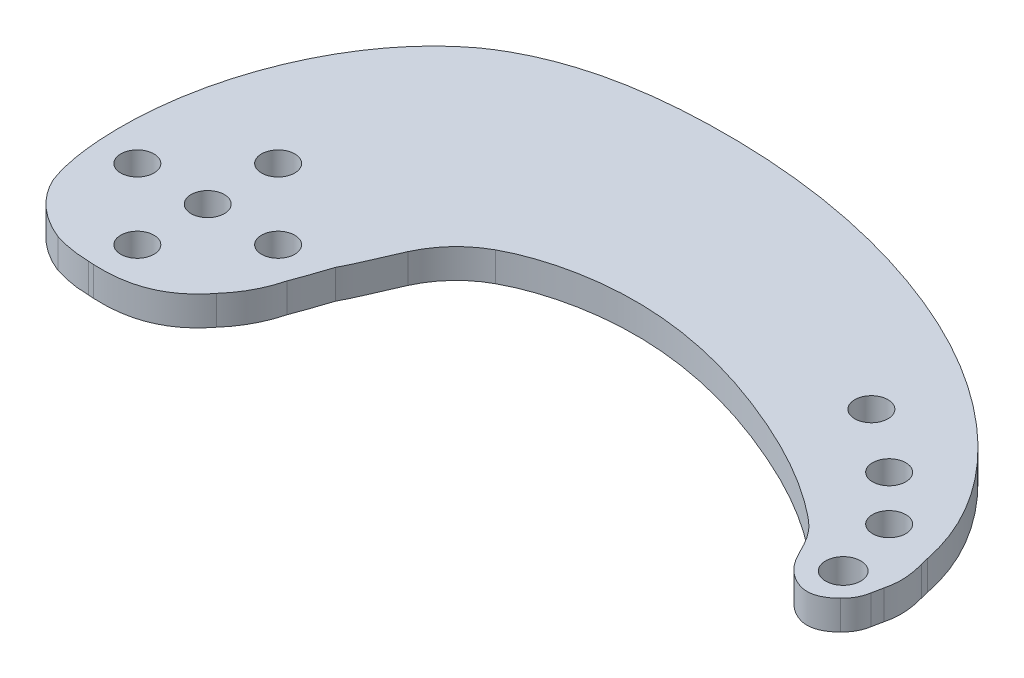
ISO-10303-21;
HEADER;
FILE_DESCRIPTION(('STEP AP214'),'2;1');
FILE_NAME('part.step','',(''),(''),'','','');
FILE_SCHEMA(('AUTOMOTIVE_DESIGN { 1 0 10303 214 1 1 1 1 }'));
ENDSEC;
DATA;
#1=APPLICATION_CONTEXT('core data for automotive mechanical design processes');
#2=APPLICATION_PROTOCOL_DEFINITION('international standard','automotive_design',2000,#1);
#3=PRODUCT_CONTEXT('',#1,'mechanical');
#4=PRODUCT('Part','Part','',(#3));
#5=PRODUCT_RELATED_PRODUCT_CATEGORY('part','',(#4));
#6=PRODUCT_DEFINITION_FORMATION('','',#4);
#7=PRODUCT_DEFINITION_CONTEXT('part definition',#1,'design');
#8=PRODUCT_DEFINITION('design','',#6,#7);
#9=PRODUCT_DEFINITION_SHAPE('','',#8);
#10=(LENGTH_UNIT() NAMED_UNIT(*) SI_UNIT(.MILLI.,.METRE.));
#11=(NAMED_UNIT(*) PLANE_ANGLE_UNIT() SI_UNIT($,.RADIAN.));
#12=(NAMED_UNIT(*) SI_UNIT($,.STERADIAN.) SOLID_ANGLE_UNIT());
#13=UNCERTAINTY_MEASURE_WITH_UNIT(LENGTH_MEASURE(1.E-05),#10,'distance_accuracy_value','');
#14=(GEOMETRIC_REPRESENTATION_CONTEXT(3) GLOBAL_UNCERTAINTY_ASSIGNED_CONTEXT((#13)) GLOBAL_UNIT_ASSIGNED_CONTEXT((#10,
#11,#12)) REPRESENTATION_CONTEXT('',''));
#15=CARTESIAN_POINT('',(0.,0.,0.));
#16=DIRECTION('',(0.,0.,1.));
#17=DIRECTION('',(1.,0.,0.));
#18=AXIS2_PLACEMENT_3D('',#15,#16,#17);
#19=CARTESIAN_POINT('',(0.,3.,0.));
#20=DIRECTION('',(0.,-1.,0.));
#21=DIRECTION('',(0.,0.,-1.));
#22=AXIS2_PLACEMENT_3D('',#19,#20,#21);
#23=CYLINDRICAL_SURFACE('',#22,11.2);
#24=CARTESIAN_POINT('',(0.,0.,0.));
#25=DIRECTION('',(0.,1.,0.));
#26=DIRECTION('',(-0.0956098133632832,0.,0.995418888503045));
#27=AXIS2_PLACEMENT_3D('',#24,#25,#26);
#28=CIRCLE('',#27,11.2);
#29=CARTESIAN_POINT('',(-1.07082990966877,0.,11.1486915512341));
#30=VERTEX_POINT('',#29);
#31=CARTESIAN_POINT('',(-0.500551392967735,0.,11.1888090654456));
#32=VERTEX_POINT('',#31);
#33=EDGE_CURVE('E462',#30,#32,#28,.T.);
#34=ORIENTED_EDGE('',*,*,#33,.T.);
#35=DIRECTION('',(0.,1.,0.));
#36=VECTOR('',#35,1.);
#37=CARTESIAN_POINT('',(-0.500551392967735,0.,11.1888090654456));
#38=LINE('',#37,#36);
#39=CARTESIAN_POINT('',(-0.500551392967735,3.,11.1888090654456));
#40=VERTEX_POINT('',#39);
#41=EDGE_CURVE('E569',#32,#40,#38,.T.);
#42=ORIENTED_EDGE('',*,*,#41,.T.);
#43=CARTESIAN_POINT('',(-1.07082990966877,3.,11.1486915512341));
#44=CARTESIAN_POINT('',(-0.7820844804733,3.,11.1737472207998));
#45=CARTESIAN_POINT('',(-0.500551392967734,3.,11.1888090654456));
#46=B_SPLINE_CURVE_WITH_KNOTS('',2,(#43,#44,#45),.UNSPECIFIED.,.F.,.F.,(3,3),(0.,1.),.UNSPECIFIED.);
#47=CARTESIAN_POINT('',(-1.07082990966877,3.,11.1486915512341));
#48=VERTEX_POINT('',#47);
#49=EDGE_CURVE('E388',#48,#40,#46,.T.);
#50=ORIENTED_EDGE('',*,*,#49,.F.);
#51=DIRECTION('',(0.,-1.,0.));
#52=VECTOR('',#51,1.);
#53=CARTESIAN_POINT('',(-1.07082990966876,3.,11.1486915512341));
#54=LINE('',#53,#52);
#55=EDGE_CURVE('E485',#30,#48,#54,.F.);
#56=ORIENTED_EDGE('',*,*,#55,.F.);
#57=EDGE_LOOP('',(#34,#42,#50,#56));
#58=FACE_BOUND('',#57,.T.);
#59=ADVANCED_FACE('F91',(#58),#23,.T.);
#60=CARTESIAN_POINT('',(0.,3.,0.));
#61=DIRECTION('',(0.,1.,0.));
#62=DIRECTION('',(0.,0.,1.));
#63=AXIS2_PLACEMENT_3D('',#60,#61,#62);
#64=PLANE('',#63);
#65=CARTESIAN_POINT('',(63.2,3.,-6.5));
#66=DIRECTION('',(0.,1.,0.));
#67=DIRECTION('',(0.,0.,1.));
#68=AXIS2_PLACEMENT_3D('',#65,#66,#67);
#69=CIRCLE('',#68,1.7);
#70=CARTESIAN_POINT('',(63.2,3.,-4.8));
#71=VERTEX_POINT('',#70);
#72=EDGE_CURVE('E987',#71,#71,#69,.F.);
#73=ORIENTED_EDGE('',*,*,#72,.T.);
#74=EDGE_LOOP('',(#73));
#75=FACE_BOUND('',#74,.T.);
#76=CARTESIAN_POINT('',(58.6038059222874,3.,-11.0961940777125));
#77=DIRECTION('',(0.,1.,0.));
#78=DIRECTION('',(0.,0.,1.));
#79=AXIS2_PLACEMENT_3D('',#76,#77,#78);
#80=CIRCLE('',#79,1.7);
#81=CARTESIAN_POINT('',(58.6038059222874,3.,-9.39619407771254));
#82=VERTEX_POINT('',#81);
#83=EDGE_CURVE('E992',#82,#82,#80,.F.);
#84=ORIENTED_EDGE('',*,*,#83,.T.);
#85=EDGE_LOOP('',(#84));
#86=FACE_BOUND('',#85,.T.);
#87=CARTESIAN_POINT('',(52.1101936762081,3.,-15.7687736647895));
#88=DIRECTION('',(0.,1.,0.));
#89=DIRECTION('',(0.,0.,1.));
#90=AXIS2_PLACEMENT_3D('',#87,#88,#89);
#91=CIRCLE('',#90,1.7);
#92=CARTESIAN_POINT('',(52.1101936762081,3.,-14.0687736647895));
#93=VERTEX_POINT('',#92);
#94=EDGE_CURVE('E996',#93,#93,#91,.F.);
#95=ORIENTED_EDGE('',*,*,#94,.T.);
#96=EDGE_LOOP('',(#95));
#97=FACE_BOUND('',#96,.T.);
#98=CARTESIAN_POINT('',(65.,3.,0.));
#99=DIRECTION('',(0.,1.,0.));
#100=DIRECTION('',(0.,0.,1.));
#101=AXIS2_PLACEMENT_3D('',#98,#99,#100);
#102=CIRCLE('',#101,1.80000000000001);
#103=CARTESIAN_POINT('',(65.,3.,1.80000000000001));
#104=VERTEX_POINT('',#103);
#105=EDGE_CURVE('E933',#104,#104,#102,.T.);
#106=ORIENTED_EDGE('',*,*,#105,.F.);
#107=EDGE_LOOP('',(#106));
#108=FACE_BOUND('',#107,.T.);
#109=CARTESIAN_POINT('',(68.3632749160278,3.,0.498379212265056));
#110=CARTESIAN_POINT('',(69.5327089634744,3.,-7.7302803130244));
#111=CARTESIAN_POINT('',(60.7384695037157,3.,-20.6272429609478));
#112=CARTESIAN_POINT('',(41.0241697035814,3.,-30.6364465018669));
#113=CARTESIAN_POINT('',(20.6209181442055,3.,-33.8057098678775));
#114=CARTESIAN_POINT('',(-5.25987588241526,3.,-29.9907346934263));
#115=CARTESIAN_POINT('',(-13.0726520334382,3.,-6.85879772464961));
#116=CARTESIAN_POINT('',(-10.2681549656934,3.,6.40085845963503));
#117=CARTESIAN_POINT('',(-7.77552409360497,3.,9.61750499049109));
#118=CARTESIAN_POINT('',(-6.46678399127295,3.,9.92262308179974));
#119=CARTESIAN_POINT('',(-2.2618839795888,3.,11.5691317782158));
#120=CARTESIAN_POINT('',(2.33580518995126,3.,11.7732460886042));
#121=CARTESIAN_POINT('',(5.20536417423154,3.,8.2634579312481));
#122=B_SPLINE_CURVE_WITH_KNOTS('',3,(#109,#110,#111,#112,#113,#114,#115,#116,#117,#118,#119,
#120,#121),.UNSPECIFIED.,.F.,.F.,(4,1,1,1,1,1,1,1,1,1,4),(0.,0.167183894636653,
0.308915577855566,0.466622558771847,0.613185697930883,0.827690468210519,0.890097790332227,
0.902058544269931,0.911312026569738,0.918105774154869,1.),.UNSPECIFIED.);
#123=CARTESIAN_POINT('',(-4.79988543367924,3.,10.5280435978897));
#124=VERTEX_POINT('',#123);
#125=EDGE_CURVE('E393',#124,#48,#122,.T.);
#126=ORIENTED_EDGE('',*,*,#125,.T.);
#127=ORIENTED_EDGE('',*,*,#49,.T.);
#128=CARTESIAN_POINT('',(-1.07082990966877,3.,11.1486915512341));
#129=CARTESIAN_POINT('',(7.81266966781571,3.,11.9195506107889));
#130=CARTESIAN_POINT('',(10.9618115500225,3.,2.85605975736582));
#131=CARTESIAN_POINT('',(14.7812707981767,3.,-9.24234019275426));
#132=CARTESIAN_POINT('',(28.5331248385567,3.,-15.1819594990336));
#133=CARTESIAN_POINT('',(44.1775618963078,3.,-11.5506373885507));
#134=CARTESIAN_POINT('',(55.3322907540599,3.,-5.54631353971218));
#135=CARTESIAN_POINT('',(59.4573127879503,3.,-2.13431577156615));
#136=CARTESIAN_POINT('',(60.7283813003198,3.,-0.393004227935778));
#137=CARTESIAN_POINT('',(61.5844545824662,3.,1.82814258342087));
#138=CARTESIAN_POINT('',(63.3373024328888,3.,3.34424394509867));
#139=CARTESIAN_POINT('',(65.4368624793034,3.,3.89829590449388));
#140=CARTESIAN_POINT('',(66.710060657466,3.,3.14542913254168));
#141=CARTESIAN_POINT('',(67.2675928087478,3.,2.5333817031224));
#142=B_SPLINE_CURVE_WITH_KNOTS('',3,(#128,#129,#130,#131,#132,#133,#134,#135,#136,#137,#138,
#139,#140,#141),.UNSPECIFIED.,.F.,.F.,(4,1,1,1,1,1,1,1,1,1,1,4),(0.,0.226108573531062,
0.317463520043916,0.429095875415199,0.705433637537204,0.851538595778845,0.872297983996491,
0.892425070632198,0.926476327540622,0.95470608552602,0.970022879338464,1.),.UNSPECIFIED.);
#143=CARTESIAN_POINT('',(8.34500863911296,3.,7.46999536901664));
#144=VERTEX_POINT('',#143);
#145=EDGE_CURVE('E229',#40,#144,#142,.T.);
#146=ORIENTED_EDGE('',*,*,#145,.T.);
#147=CARTESIAN_POINT('',(0.,3.,0.));
#148=DIRECTION('',(0.,1.,0.));
#149=DIRECTION('',(0.,0.,1.));
#150=AXIS2_PLACEMENT_3D('',#147,#148,#149);
#151=CIRCLE('',#150,11.2);
#152=CARTESIAN_POINT('',(10.8591488557205,3.,2.74205873921496));
#153=VERTEX_POINT('',#152);
#154=EDGE_CURVE('E284',#144,#153,#151,.T.);
#155=ORIENTED_EDGE('',*,*,#154,.T.);
#156=CARTESIAN_POINT('',(12.1345021406351,3.,-0.93400958023566));
#157=VERTEX_POINT('',#156);
#158=EDGE_CURVE('E932',#153,#157,#142,.T.);
#159=ORIENTED_EDGE('',*,*,#158,.T.);
#160=CARTESIAN_POINT('',(11.2,3.,0.));
#161=CARTESIAN_POINT('',(12.4456138486092,3.,0.0569469326884399));
#162=CARTESIAN_POINT('',(16.5714079345787,3.,-16.8023603290307));
#163=CARTESIAN_POINT('',(35.7888249050512,3.,-14.2526836415331));
#164=CARTESIAN_POINT('',(51.249640160631,3.,-9.44242237656511));
#165=CARTESIAN_POINT('',(60.2382591428152,3.,-2.74156307411873));
#166=CARTESIAN_POINT('',(64.7703602781485,3.,5.18735759287177));
#167=CARTESIAN_POINT('',(69.2065771426152,3.,0.00249513195444879));
#168=CARTESIAN_POINT('',(68.3960994393687,3.,-6.37671389292951));
#169=CARTESIAN_POINT('',(55.9681183284351,3.,-24.9502162671026));
#170=CARTESIAN_POINT('',(5.62590445738057,3.,-36.5085659273181));
#171=CARTESIAN_POINT('',(9.99049700339859,3.,-0.0552960179519843));
#172=CARTESIAN_POINT('',(11.2,3.,0.));
#173=B_SPLINE_CURVE_WITH_KNOTS('',3,(#160,#161,#162,#163,#164,#165,#166,#167,#168,#169,#170,
#171,#172),.UNSPECIFIED.,.T.,.F.,(4,1,1,1,1,1,1,1,1,1,4),(0.,0.0811612165853412,
0.198317789022384,0.331056991872656,0.406547512564206,0.438622354198174,0.470697195832143,
0.501390038427487,0.565670643333817,0.921191680088181,1.),.UNSPECIFIED.);
#174=CARTESIAN_POINT('',(14.442898006834,3.,-6.02607582134549));
#175=VERTEX_POINT('',#174);
#176=EDGE_CURVE('E256',#157,#175,#173,.T.);
#177=ORIENTED_EDGE('',*,*,#176,.T.);
#178=CARTESIAN_POINT('',(23.5409924137367,3.,-1.8758134003549));
#179=DIRECTION('',(0.,1.,0.));
#180=DIRECTION('',(0.,0.,1.));
#181=AXIS2_PLACEMENT_3D('',#178,#179,#180);
#182=CIRCLE('',#181,10.);
#183=CARTESIAN_POINT('',(18.77797037029,3.,-10.668629844114));
#184=VERTEX_POINT('',#183);
#185=EDGE_CURVE('E930',#175,#184,#182,.F.);
#186=ORIENTED_EDGE('',*,*,#185,.T.);
#187=CARTESIAN_POINT('',(67.2675928087478,3.,2.5333817031224));
#188=VERTEX_POINT('',#187);
#189=EDGE_CURVE('E929',#184,#188,#142,.T.);
#190=ORIENTED_EDGE('',*,*,#189,.T.);
#191=CARTESIAN_POINT('',(65.,3.,0.));
#192=DIRECTION('',(0.,1.,0.));
#193=DIRECTION('',(0.,0.,1.));
#194=AXIS2_PLACEMENT_3D('',#191,#192,#193);
#195=CIRCLE('',#194,3.4);
#196=CARTESIAN_POINT('',(68.3632749160278,3.,0.498379212265056));
#197=VERTEX_POINT('',#196);
#198=EDGE_CURVE('E236',#188,#197,#195,.T.);
#199=ORIENTED_EDGE('',*,*,#198,.T.);
#200=CARTESIAN_POINT('',(68.5837850238534,3.,-0.577958598186552));
#201=CARTESIAN_POINT('',(68.4439211205088,3.,-0.0458556794172109));
#202=CARTESIAN_POINT('',(68.3632749160279,3.,0.498379212265056));
#203=(BOUNDED_CURVE() B_SPLINE_CURVE(2,(#200,#201,#202),.UNSPECIFIED.,.F.,
.F.) B_SPLINE_CURVE_WITH_KNOTS((3,3),(0.,1.),
.UNSPECIFIED.) CURVE() GEOMETRIC_REPRESENTATION_ITEM() RATIONAL_B_SPLINE_CURVE((1.,
0.99848995013738,1.)) REPRESENTATION_ITEM(''));
#204=CARTESIAN_POINT('',(68.5837850238534,3.,-0.577958598186534));
#205=VERTEX_POINT('',#204);
#206=EDGE_CURVE('E438',#197,#205,#203,.F.);
#207=ORIENTED_EDGE('',*,*,#206,.T.);
#208=CARTESIAN_POINT('',(68.3925200024542,3.,-4.62779751741606));
#209=VERTEX_POINT('',#208);
#210=EDGE_CURVE('E294',#205,#209,#173,.T.);
#211=ORIENTED_EDGE('',*,*,#210,.T.);
#212=CARTESIAN_POINT('',(78.0178833995298,3.,-7.33932466539684));
#213=DIRECTION('',(0.,1.,0.));
#214=DIRECTION('',(0.,0.,1.));
#215=AXIS2_PLACEMENT_3D('',#212,#213,#214);
#216=CIRCLE('',#215,10.);
#217=CARTESIAN_POINT('',(68.2066528093629,3.,-5.40548022838214));
#218=VERTEX_POINT('',#217);
#219=EDGE_CURVE('E14',#209,#218,#216,.F.);
#220=ORIENTED_EDGE('',*,*,#219,.T.);
#221=CARTESIAN_POINT('',(0.0138210508619621,3.,-27.6880218674776));
#222=VERTEX_POINT('',#221);
#223=EDGE_CURVE('E492',#218,#222,#122,.T.);
#224=ORIENTED_EDGE('',*,*,#223,.T.);
#225=CARTESIAN_POINT('',(-1.07082990966877,3.,11.1486915512341));
#226=CARTESIAN_POINT('',(-4.63209882172822,3.,11.3725423228068));
#227=CARTESIAN_POINT('',(-9.74374591302616,3.,8.36577886155107));
#228=CARTESIAN_POINT('',(-10.9059828329124,3.,2.80619952022057));
#229=CARTESIAN_POINT('',(-12.5638425339583,3.,-11.2275648792662));
#230=CARTESIAN_POINT('',(-5.89160509364851,3.,-27.3023323297547));
#231=CARTESIAN_POINT('',(6.19807491272095,3.,-30.7694132466769));
#232=B_SPLINE_CURVE_WITH_KNOTS('',3,(#225,#226,#227,#228,#229,#230,#231),.UNSPECIFIED.,.F.,.F.,
(4,1,1,1,4),(0.,0.203093443995204,0.264365632395995,0.313017021780033,1.),.UNSPECIFIED.);
#233=CARTESIAN_POINT('',(-11.131062852218,3.,-5.72574957686047));
#234=VERTEX_POINT('',#233);
#235=EDGE_CURVE('E547',#234,#222,#232,.T.);
#236=ORIENTED_EDGE('',*,*,#235,.F.);
#237=CARTESIAN_POINT('',(-11.2000000245663,3.,-3.2727820953869E-07));
#238=VERTEX_POINT('',#237);
#239=EDGE_CURVE('E499',#234,#238,#122,.T.);
#240=ORIENTED_EDGE('',*,*,#239,.T.);
#241=CARTESIAN_POINT('',(-10.8970833817113,3.,2.58719418769911));
#242=VERTEX_POINT('',#241);
#243=EDGE_CURVE('E555',#242,#238,#232,.T.);
#244=ORIENTED_EDGE('',*,*,#243,.F.);
#245=CARTESIAN_POINT('',(-10.0484737126304,3.,5.75614022844135));
#246=VERTEX_POINT('',#245);
#247=EDGE_CURVE('E500',#242,#246,#122,.T.);
#248=ORIENTED_EDGE('',*,*,#247,.T.);
#249=EDGE_CURVE('E557',#124,#246,#232,.T.);
#250=ORIENTED_EDGE('',*,*,#249,.F.);
#251=EDGE_LOOP('',(#126,#127,#146,#155,#159,#177,#186,#190,#199,#207,#211,#220,#224,#236,#240,
#244,#248,#250));
#252=FACE_BOUND('',#251,.T.);
#253=CARTESIAN_POINT('',(0.,3.,7.2));
#254=DIRECTION('',(0.,1.,0.));
#255=DIRECTION('',(0.,0.,1.));
#256=AXIS2_PLACEMENT_3D('',#253,#254,#255);
#257=CIRCLE('',#256,1.7);
#258=CARTESIAN_POINT('',(0.,3.,8.9));
#259=VERTEX_POINT('',#258);
#260=EDGE_CURVE('E289',#259,#259,#257,.T.);
#261=ORIENTED_EDGE('',*,*,#260,.F.);
#262=EDGE_LOOP('',(#261));
#263=FACE_BOUND('',#262,.T.);
#264=CARTESIAN_POINT('',(7.2,3.,0.));
#265=DIRECTION('',(0.,1.,0.));
#266=DIRECTION('',(0.,0.,1.));
#267=AXIS2_PLACEMENT_3D('',#264,#265,#266);
#268=CIRCLE('',#267,1.7);
#269=CARTESIAN_POINT('',(7.2,3.,1.7));
#270=VERTEX_POINT('',#269);
#271=EDGE_CURVE('E894',#270,#270,#268,.T.);
#272=ORIENTED_EDGE('',*,*,#271,.F.);
#273=EDGE_LOOP('',(#272));
#274=FACE_BOUND('',#273,.T.);
#275=CARTESIAN_POINT('',(0.,3.,-7.2));
#276=DIRECTION('',(0.,1.,0.));
#277=DIRECTION('',(0.,0.,1.));
#278=AXIS2_PLACEMENT_3D('',#275,#276,#277);
#279=CIRCLE('',#278,1.7);
#280=CARTESIAN_POINT('',(0.,3.,-5.5));
#281=VERTEX_POINT('',#280);
#282=EDGE_CURVE('E908',#281,#281,#279,.T.);
#283=ORIENTED_EDGE('',*,*,#282,.F.);
#284=EDGE_LOOP('',(#283));
#285=FACE_BOUND('',#284,.T.);
#286=CARTESIAN_POINT('',(0.,3.,0.));
#287=DIRECTION('',(0.,1.,0.));
#288=DIRECTION('',(0.,0.,1.));
#289=AXIS2_PLACEMENT_3D('',#286,#287,#288);
#290=CIRCLE('',#289,1.7);
#291=CARTESIAN_POINT('',(0.,3.,1.7));
#292=VERTEX_POINT('',#291);
#293=EDGE_CURVE('E914',#292,#292,#290,.T.);
#294=ORIENTED_EDGE('',*,*,#293,.F.);
#295=EDGE_LOOP('',(#294));
#296=FACE_BOUND('',#295,.T.);
#297=CARTESIAN_POINT('',(-7.2,3.,0.));
#298=DIRECTION('',(0.,1.,0.));
#299=DIRECTION('',(0.,0.,1.));
#300=AXIS2_PLACEMENT_3D('',#297,#298,#299);
#301=CIRCLE('',#300,1.7);
#302=CARTESIAN_POINT('',(-7.2,3.,1.7));
#303=VERTEX_POINT('',#302);
#304=EDGE_CURVE('E920',#303,#303,#301,.T.);
#305=ORIENTED_EDGE('',*,*,#304,.F.);
#306=EDGE_LOOP('',(#305));
#307=FACE_BOUND('',#306,.T.);
#308=ADVANCED_FACE('F395',(#75,#86,#97,#108,#252,#263,#274,#285,#296,#307),#64,.T.);
#309=CARTESIAN_POINT('',(0.,0.,0.));
#310=DIRECTION('',(0.,1.,0.));
#311=DIRECTION('',(0.,0.,1.));
#312=AXIS2_PLACEMENT_3D('',#309,#310,#311);
#313=PLANE('',#312);
#314=CARTESIAN_POINT('',(63.2,0.,-6.5));
#315=DIRECTION('',(0.,1.,0.));
#316=DIRECTION('',(0.,0.,1.));
#317=AXIS2_PLACEMENT_3D('',#314,#315,#316);
#318=CIRCLE('',#317,1.7);
#319=CARTESIAN_POINT('',(63.2,0.,-4.8));
#320=VERTEX_POINT('',#319);
#321=EDGE_CURVE('E1000',#320,#320,#318,.T.);
#322=ORIENTED_EDGE('',*,*,#321,.T.);
#323=EDGE_LOOP('',(#322));
#324=FACE_BOUND('',#323,.T.);
#325=CARTESIAN_POINT('',(58.6038059222874,0.,-11.0961940777125));
#326=DIRECTION('',(0.,1.,0.));
#327=DIRECTION('',(0.,0.,1.));
#328=AXIS2_PLACEMENT_3D('',#325,#326,#327);
#329=CIRCLE('',#328,1.7);
#330=CARTESIAN_POINT('',(58.6038059222874,0.,-9.39619407771254));
#331=VERTEX_POINT('',#330);
#332=EDGE_CURVE('E1005',#331,#331,#329,.T.);
#333=ORIENTED_EDGE('',*,*,#332,.T.);
#334=EDGE_LOOP('',(#333));
#335=FACE_BOUND('',#334,.T.);
#336=CARTESIAN_POINT('',(52.1101936762081,0.,-15.7687736647895));
#337=DIRECTION('',(0.,1.,0.));
#338=DIRECTION('',(0.,0.,1.));
#339=AXIS2_PLACEMENT_3D('',#336,#337,#338);
#340=CIRCLE('',#339,1.7);
#341=CARTESIAN_POINT('',(52.1101936762081,0.,-14.0687736647895));
#342=VERTEX_POINT('',#341);
#343=EDGE_CURVE('E1001',#342,#342,#340,.T.);
#344=ORIENTED_EDGE('',*,*,#343,.T.);
#345=EDGE_LOOP('',(#344));
#346=FACE_BOUND('',#345,.T.);
#347=CARTESIAN_POINT('',(65.,0.,0.));
#348=DIRECTION('',(0.,1.,0.));
#349=DIRECTION('',(0.,0.,1.));
#350=AXIS2_PLACEMENT_3D('',#347,#348,#349);
#351=CIRCLE('',#350,1.80000000000001);
#352=CARTESIAN_POINT('',(65.,0.,1.80000000000001));
#353=VERTEX_POINT('',#352);
#354=EDGE_CURVE('E939',#353,#353,#351,.T.);
#355=ORIENTED_EDGE('',*,*,#354,.T.);
#356=EDGE_LOOP('',(#355));
#357=FACE_BOUND('',#356,.T.);
#358=ORIENTED_EDGE('',*,*,#33,.F.);
#359=CARTESIAN_POINT('',(68.3632749160278,0.,0.498379212265056));
#360=CARTESIAN_POINT('',(69.5327089634744,0.,-7.7302803130244));
#361=CARTESIAN_POINT('',(60.7384695037157,0.,-20.6272429609478));
#362=CARTESIAN_POINT('',(41.0241697035814,0.,-30.6364465018669));
#363=CARTESIAN_POINT('',(20.6209181442055,0.,-33.8057098678775));
#364=CARTESIAN_POINT('',(-5.25987588241526,0.,-29.9907346934263));
#365=CARTESIAN_POINT('',(-13.0726520334382,0.,-6.85879772464961));
#366=CARTESIAN_POINT('',(-10.2681549656934,0.,6.40085845963503));
#367=CARTESIAN_POINT('',(-7.77552409360497,0.,9.61750499049109));
#368=CARTESIAN_POINT('',(-6.46678399127295,0.,9.92262308179974));
#369=CARTESIAN_POINT('',(-2.2618839795888,0.,11.5691317782158));
#370=CARTESIAN_POINT('',(2.33580518995126,0.,11.7732460886042));
#371=CARTESIAN_POINT('',(5.20536417423154,0.,8.2634579312481));
#372=B_SPLINE_CURVE_WITH_KNOTS('',3,(#359,#360,#361,#362,#363,#364,#365,#366,#367,#368,#369,
#370,#371),.UNSPECIFIED.,.F.,.F.,(4,1,1,1,1,1,1,1,1,1,4),(0.,0.167183894636653,
0.308915577855566,0.466622558771847,0.613185697930883,0.827690468210519,0.890097790332227,
0.902058544269931,0.911312026569738,0.918105774154869,1.),.UNSPECIFIED.);
#373=CARTESIAN_POINT('',(-4.79988543367924,0.,10.5280435978897));
#374=VERTEX_POINT('',#373);
#375=EDGE_CURVE('E502',#374,#30,#372,.T.);
#376=ORIENTED_EDGE('',*,*,#375,.F.);
#377=CARTESIAN_POINT('',(-1.07082990966877,0.,11.1486915512341));
#378=CARTESIAN_POINT('',(-4.63209882172822,0.,11.3725423228068));
#379=CARTESIAN_POINT('',(-9.74374591302616,0.,8.36577886155107));
#380=CARTESIAN_POINT('',(-10.9059828329124,0.,2.80619952022057));
#381=CARTESIAN_POINT('',(-12.5638425339583,0.,-11.2275648792662));
#382=CARTESIAN_POINT('',(-5.89160509364851,0.,-27.3023323297547));
#383=CARTESIAN_POINT('',(6.19807491272095,0.,-30.7694132466769));
#384=B_SPLINE_CURVE_WITH_KNOTS('',3,(#377,#378,#379,#380,#381,#382,#383),.UNSPECIFIED.,.F.,.F.,
(4,1,1,1,4),(0.,0.203093443995204,0.264365632395995,0.313017021780033,1.),.UNSPECIFIED.);
#385=CARTESIAN_POINT('',(-10.0484737141454,0.,5.75614022506111));
#386=VERTEX_POINT('',#385);
#387=EDGE_CURVE('E556',#374,#386,#384,.T.);
#388=ORIENTED_EDGE('',*,*,#387,.T.);
#389=CARTESIAN_POINT('',(-10.8970833810502,0.,2.58719419186895));
#390=VERTEX_POINT('',#389);
#391=EDGE_CURVE('E506',#390,#386,#372,.T.);
#392=ORIENTED_EDGE('',*,*,#391,.F.);
#393=CARTESIAN_POINT('',(-11.2000000245663,0.,-3.2727820953869E-07));
#394=VERTEX_POINT('',#393);
#395=EDGE_CURVE('E568',#390,#394,#384,.T.);
#396=ORIENTED_EDGE('',*,*,#395,.T.);
#397=CARTESIAN_POINT('',(-11.131062852218,0.,-5.72574957686047));
#398=VERTEX_POINT('',#397);
#399=EDGE_CURVE('E515',#398,#394,#372,.T.);
#400=ORIENTED_EDGE('',*,*,#399,.F.);
#401=CARTESIAN_POINT('',(0.0138209326869753,0.,-27.6880217798218));
#402=VERTEX_POINT('',#401);
#403=EDGE_CURVE('E560',#398,#402,#384,.T.);
#404=ORIENTED_EDGE('',*,*,#403,.T.);
#405=CARTESIAN_POINT('',(68.2066528093629,0.,-5.40548022838214));
#406=VERTEX_POINT('',#405);
#407=EDGE_CURVE('E516',#406,#402,#372,.T.);
#408=ORIENTED_EDGE('',*,*,#407,.F.);
#409=CARTESIAN_POINT('',(78.0178833995298,0.,-7.33932466539684));
#410=DIRECTION('',(0.,1.,0.));
#411=DIRECTION('',(0.,0.,1.));
#412=AXIS2_PLACEMENT_3D('',#409,#410,#411);
#413=CIRCLE('',#412,10.);
#414=CARTESIAN_POINT('',(68.3925200024542,0.,-4.62779751741606));
#415=VERTEX_POINT('',#414);
#416=EDGE_CURVE('E100',#406,#415,#413,.T.);
#417=ORIENTED_EDGE('',*,*,#416,.T.);
#418=CARTESIAN_POINT('',(11.2,0.,0.));
#419=CARTESIAN_POINT('',(12.4456138486092,0.,0.0569469326884399));
#420=CARTESIAN_POINT('',(16.5714079345787,0.,-16.8023603290307));
#421=CARTESIAN_POINT('',(35.7888249050512,0.,-14.2526836415331));
#422=CARTESIAN_POINT('',(51.249640160631,0.,-9.44242237656511));
#423=CARTESIAN_POINT('',(60.2382591428152,0.,-2.74156307411873));
#424=CARTESIAN_POINT('',(64.7703602781485,0.,5.18735759287177));
#425=CARTESIAN_POINT('',(69.2065771426152,0.,0.00249513195444879));
#426=CARTESIAN_POINT('',(68.3960994393687,0.,-6.37671389292951));
#427=CARTESIAN_POINT('',(55.9681183284351,0.,-24.9502162671026));
#428=CARTESIAN_POINT('',(5.62590445738057,0.,-36.5085659273181));
#429=CARTESIAN_POINT('',(9.99049700339859,0.,-0.0552960179519843));
#430=CARTESIAN_POINT('',(11.2,0.,0.));
#431=B_SPLINE_CURVE_WITH_KNOTS('',3,(#418,#419,#420,#421,#422,#423,#424,#425,#426,#427,#428,
#429,#430),.UNSPECIFIED.,.T.,.F.,(4,1,1,1,1,1,1,1,1,1,4),(0.,0.0811612165853412,
0.198317789022384,0.331056991872656,0.406547512564206,0.438622354198174,0.470697195832143,
0.501390038427487,0.565670643333817,0.921191680088181,1.),.UNSPECIFIED.);
#432=CARTESIAN_POINT('',(68.5837850238534,0.,-0.577958598186543));
#433=VERTEX_POINT('',#432);
#434=EDGE_CURVE('E322',#433,#415,#431,.T.);
#435=ORIENTED_EDGE('',*,*,#434,.F.);
#436=CARTESIAN_POINT('',(68.3632749160278,0.,0.498379212265056));
#437=CARTESIAN_POINT('',(68.4439211205088,0.,-0.0458556794172109));
#438=CARTESIAN_POINT('',(68.5837850238534,0.,-0.577958598186552));
#439=(BOUNDED_CURVE() B_SPLINE_CURVE(2,(#436,#437,#438),.UNSPECIFIED.,.F.,
.F.) B_SPLINE_CURVE_WITH_KNOTS((3,3),(0.,1.),
.UNSPECIFIED.) CURVE() GEOMETRIC_REPRESENTATION_ITEM() RATIONAL_B_SPLINE_CURVE((1.,
0.99848995013738,1.)) REPRESENTATION_ITEM(''));
#440=CARTESIAN_POINT('',(68.3632749160278,0.,0.498379212265056));
#441=VERTEX_POINT('',#440);
#442=EDGE_CURVE('E243',#433,#441,#439,.F.);
#443=ORIENTED_EDGE('',*,*,#442,.T.);
#444=CARTESIAN_POINT('',(65.,0.,0.));
#445=DIRECTION('',(0.,1.,0.));
#446=DIRECTION('',(0.,0.,1.));
#447=AXIS2_PLACEMENT_3D('',#444,#445,#446);
#448=CIRCLE('',#447,3.4);
#449=CARTESIAN_POINT('',(67.2675928087478,0.,2.5333817031224));
#450=VERTEX_POINT('',#449);
#451=EDGE_CURVE('E234',#450,#441,#448,.T.);
#452=ORIENTED_EDGE('',*,*,#451,.F.);
#453=CARTESIAN_POINT('',(-1.07082990966877,0.,11.1486915512341));
#454=CARTESIAN_POINT('',(7.81266966781571,0.,11.9195506107889));
#455=CARTESIAN_POINT('',(10.9618115500225,0.,2.85605975736582));
#456=CARTESIAN_POINT('',(14.7812707981767,0.,-9.24234019275426));
#457=CARTESIAN_POINT('',(28.5331248385567,0.,-15.1819594990336));
#458=CARTESIAN_POINT('',(44.1775618963078,0.,-11.5506373885507));
#459=CARTESIAN_POINT('',(55.3322907540599,0.,-5.54631353971218));
#460=CARTESIAN_POINT('',(59.4573127879503,0.,-2.13431577156615));
#461=CARTESIAN_POINT('',(60.7283813003198,0.,-0.393004227935778));
#462=CARTESIAN_POINT('',(61.5844545824662,0.,1.82814258342087));
#463=CARTESIAN_POINT('',(63.3373024328888,0.,3.34424394509867));
#464=CARTESIAN_POINT('',(65.4368624793034,0.,3.89829590449388));
#465=CARTESIAN_POINT('',(66.710060657466,0.,3.14542913254168));
#466=CARTESIAN_POINT('',(67.2675928087478,0.,2.5333817031224));
#467=B_SPLINE_CURVE_WITH_KNOTS('',3,(#453,#454,#455,#456,#457,#458,#459,#460,#461,#462,#463,
#464,#465,#466),.UNSPECIFIED.,.F.,.F.,(4,1,1,1,1,1,1,1,1,1,1,4),(0.,0.226108573531062,
0.317463520043916,0.429095875415199,0.705433637537204,0.851538595778845,0.872297983996491,
0.892425070632198,0.926476327540622,0.95470608552602,0.970022879338464,1.),.UNSPECIFIED.);
#468=CARTESIAN_POINT('',(18.77797037029,0.,-10.668629844114));
#469=VERTEX_POINT('',#468);
#470=EDGE_CURVE('E217',#469,#450,#467,.T.);
#471=ORIENTED_EDGE('',*,*,#470,.F.);
#472=CARTESIAN_POINT('',(23.5409924137367,0.,-1.8758134003549));
#473=DIRECTION('',(0.,1.,0.));
#474=DIRECTION('',(0.,0.,1.));
#475=AXIS2_PLACEMENT_3D('',#472,#473,#474);
#476=CIRCLE('',#475,10.);
#477=CARTESIAN_POINT('',(14.442898006834,0.,-6.02607582134549));
#478=VERTEX_POINT('',#477);
#479=EDGE_CURVE('E480',#469,#478,#476,.T.);
#480=ORIENTED_EDGE('',*,*,#479,.T.);
#481=CARTESIAN_POINT('',(12.1345021371112,0.,-0.934009569390313));
#482=VERTEX_POINT('',#481);
#483=EDGE_CURVE('E295',#482,#478,#431,.T.);
#484=ORIENTED_EDGE('',*,*,#483,.F.);
#485=CARTESIAN_POINT('',(10.8591488557205,0.,2.74205873921496));
#486=VERTEX_POINT('',#485);
#487=EDGE_CURVE('E228',#486,#482,#467,.T.);
#488=ORIENTED_EDGE('',*,*,#487,.F.);
#489=CARTESIAN_POINT('',(0.,0.,0.));
#490=DIRECTION('',(0.,1.,0.));
#491=DIRECTION('',(0.,0.,1.));
#492=AXIS2_PLACEMENT_3D('',#489,#490,#491);
#493=CIRCLE('',#492,11.2);
#494=CARTESIAN_POINT('',(8.34500863911296,0.,7.46999536901664));
#495=VERTEX_POINT('',#494);
#496=EDGE_CURVE('E248',#495,#486,#493,.T.);
#497=ORIENTED_EDGE('',*,*,#496,.F.);
#498=EDGE_CURVE('E239',#32,#495,#467,.T.);
#499=ORIENTED_EDGE('',*,*,#498,.F.);
#500=EDGE_LOOP('',(#358,#376,#388,#392,#396,#400,#404,#408,#417,#435,#443,#452,#471,#480,#484,
#488,#497,#499));
#501=FACE_BOUND('',#500,.T.);
#502=CARTESIAN_POINT('',(0.,0.,7.2));
#503=DIRECTION('',(0.,1.,0.));
#504=DIRECTION('',(0.,0.,1.));
#505=AXIS2_PLACEMENT_3D('',#502,#503,#504);
#506=CIRCLE('',#505,1.7);
#507=CARTESIAN_POINT('',(0.,0.,8.9));
#508=VERTEX_POINT('',#507);
#509=EDGE_CURVE('E280',#508,#508,#506,.T.);
#510=ORIENTED_EDGE('',*,*,#509,.T.);
#511=EDGE_LOOP('',(#510));
#512=FACE_BOUND('',#511,.T.);
#513=CARTESIAN_POINT('',(7.2,0.,0.));
#514=DIRECTION('',(0.,1.,0.));
#515=DIRECTION('',(0.,0.,1.));
#516=AXIS2_PLACEMENT_3D('',#513,#514,#515);
#517=CIRCLE('',#516,1.7);
#518=CARTESIAN_POINT('',(7.2,0.,1.7));
#519=VERTEX_POINT('',#518);
#520=EDGE_CURVE('E276',#519,#519,#517,.T.);
#521=ORIENTED_EDGE('',*,*,#520,.T.);
#522=EDGE_LOOP('',(#521));
#523=FACE_BOUND('',#522,.T.);
#524=CARTESIAN_POINT('',(0.,0.,-7.2));
#525=DIRECTION('',(0.,1.,0.));
#526=DIRECTION('',(0.,0.,1.));
#527=AXIS2_PLACEMENT_3D('',#524,#525,#526);
#528=CIRCLE('',#527,1.7);
#529=CARTESIAN_POINT('',(0.,0.,-5.5));
#530=VERTEX_POINT('',#529);
#531=EDGE_CURVE('E272',#530,#530,#528,.T.);
#532=ORIENTED_EDGE('',*,*,#531,.T.);
#533=EDGE_LOOP('',(#532));
#534=FACE_BOUND('',#533,.T.);
#535=CARTESIAN_POINT('',(0.,0.,0.));
#536=DIRECTION('',(0.,1.,0.));
#537=DIRECTION('',(0.,0.,1.));
#538=AXIS2_PLACEMENT_3D('',#535,#536,#537);
#539=CIRCLE('',#538,1.7);
#540=CARTESIAN_POINT('',(0.,0.,1.7));
#541=VERTEX_POINT('',#540);
#542=EDGE_CURVE('E253',#541,#541,#539,.T.);
#543=ORIENTED_EDGE('',*,*,#542,.T.);
#544=EDGE_LOOP('',(#543));
#545=FACE_BOUND('',#544,.T.);
#546=CARTESIAN_POINT('',(-7.2,0.,0.));
#547=DIRECTION('',(0.,1.,0.));
#548=DIRECTION('',(0.,0.,1.));
#549=AXIS2_PLACEMENT_3D('',#546,#547,#548);
#550=CIRCLE('',#549,1.7);
#551=CARTESIAN_POINT('',(-7.2,0.,1.7));
#552=VERTEX_POINT('',#551);
#553=EDGE_CURVE('E247',#552,#552,#550,.T.);
#554=ORIENTED_EDGE('',*,*,#553,.T.);
#555=EDGE_LOOP('',(#554));
#556=FACE_BOUND('',#555,.T.);
#557=ADVANCED_FACE('F241',(#324,#335,#346,#357,#501,#512,#523,#534,#545,#556),#313,.F.);
#558=DIRECTION('',(0.,-1.,0.));
#559=VECTOR('',#558,1.);
#560=SURFACE_OF_LINEAR_EXTRUSION('',#122,#559);
#561=DIRECTION('',(0.,-1.,0.));
#562=VECTOR('',#561,1.);
#563=CARTESIAN_POINT('',(-11.1310628217515,3.,-5.72574989727561));
#564=LINE('',#563,#562);
#565=EDGE_CURVE('E507',#398,#234,#564,.F.);
#566=ORIENTED_EDGE('',*,*,#565,.F.);
#567=ORIENTED_EDGE('',*,*,#399,.T.);
#568=DIRECTION('',(0.,-1.,0.));
#569=VECTOR('',#568,1.);
#570=CARTESIAN_POINT('',(-11.2,3.,0.));
#571=LINE('',#570,#569);
#572=EDGE_CURVE('E285',#238,#394,#571,.T.);
#573=ORIENTED_EDGE('',*,*,#572,.F.);
#574=ORIENTED_EDGE('',*,*,#239,.F.);
#575=EDGE_LOOP('',(#566,#567,#573,#574));
#576=FACE_BOUND('',#575,.T.);
#577=ADVANCED_FACE('F531',(#576),#560,.F.);
#578=ORIENTED_EDGE('',*,*,#223,.F.);
#579=DIRECTION('',(0.,-1.,0.));
#580=VECTOR('',#579,1.);
#581=CARTESIAN_POINT('',(68.2066528093629,3.,-5.40548022838214));
#582=LINE('',#581,#580);
#583=EDGE_CURVE('E1034',#218,#406,#582,.T.);
#584=ORIENTED_EDGE('',*,*,#583,.T.);
#585=ORIENTED_EDGE('',*,*,#407,.T.);
#586=DIRECTION('',(0.,-1.,0.));
#587=VECTOR('',#586,1.);
#588=CARTESIAN_POINT('',(0.013821050839828,3.,-27.6880218674612));
#589=LINE('',#588,#587);
#590=EDGE_CURVE('E570',#222,#402,#589,.T.);
#591=ORIENTED_EDGE('',*,*,#590,.F.);
#592=EDGE_LOOP('',(#578,#584,#585,#591));
#593=FACE_BOUND('',#592,.T.);
#594=ADVANCED_FACE('F534',(#593),#560,.F.);
#595=DIRECTION('',(0.,-1.,0.));
#596=VECTOR('',#595,1.);
#597=CARTESIAN_POINT('',(-4.79988540709954,3.,10.5280436082265));
#598=LINE('',#597,#596);
#599=EDGE_CURVE('E261',#374,#124,#598,.F.);
#600=ORIENTED_EDGE('',*,*,#599,.F.);
#601=ORIENTED_EDGE('',*,*,#375,.T.);
#602=ORIENTED_EDGE('',*,*,#55,.T.);
#603=ORIENTED_EDGE('',*,*,#125,.F.);
#604=EDGE_LOOP('',(#600,#601,#602,#603));
#605=FACE_BOUND('',#604,.T.);
#606=ADVANCED_FACE('F607',(#605),#560,.F.);
#607=DIRECTION('',(0.,-1.,0.));
#608=VECTOR('',#607,1.);
#609=CARTESIAN_POINT('',(-10.0484737126741,3.,5.75614022832721));
#610=LINE('',#609,#608);
#611=EDGE_CURVE('E450',#246,#386,#610,.T.);
#612=ORIENTED_EDGE('',*,*,#611,.F.);
#613=ORIENTED_EDGE('',*,*,#247,.F.);
#614=DIRECTION('',(0.,-1.,0.));
#615=VECTOR('',#614,1.);
#616=CARTESIAN_POINT('',(-10.8970833810502,3.,2.58719419186896));
#617=LINE('',#616,#615);
#618=EDGE_CURVE('E302',#242,#390,#617,.T.);
#619=ORIENTED_EDGE('',*,*,#618,.T.);
#620=ORIENTED_EDGE('',*,*,#391,.T.);
#621=EDGE_LOOP('',(#612,#613,#619,#620));
#622=FACE_BOUND('',#621,.T.);
#623=ADVANCED_FACE('F359',(#622),#560,.F.);
#624=ORIENTED_EDGE('',*,*,#154,.F.);
#625=DIRECTION('',(0.,1.,0.));
#626=VECTOR('',#625,1.);
#627=CARTESIAN_POINT('',(8.34500863911296,0.,7.46999536901664));
#628=LINE('',#627,#626);
#629=EDGE_CURVE('E969',#144,#495,#628,.F.);
#630=ORIENTED_EDGE('',*,*,#629,.T.);
#631=ORIENTED_EDGE('',*,*,#496,.T.);
#632=DIRECTION('',(0.,1.,0.));
#633=VECTOR('',#632,1.);
#634=CARTESIAN_POINT('',(10.8591488557205,0.,2.74205873921496));
#635=LINE('',#634,#633);
#636=EDGE_CURVE('E238',#486,#153,#635,.T.);
#637=ORIENTED_EDGE('',*,*,#636,.T.);
#638=EDGE_LOOP('',(#624,#630,#631,#637));
#639=FACE_BOUND('',#638,.T.);
#640=ADVANCED_FACE('F355',(#639),#23,.T.);
#641=DIRECTION('',(0.,-1.,0.));
#642=VECTOR('',#641,1.);
#643=SURFACE_OF_LINEAR_EXTRUSION('',#173,#642);
#644=ORIENTED_EDGE('',*,*,#434,.T.);
#645=DIRECTION('',(0.,-1.,0.));
#646=VECTOR('',#645,1.);
#647=CARTESIAN_POINT('',(68.3925200024542,0.,-4.62779751741606));
#648=LINE('',#647,#646);
#649=EDGE_CURVE('E113',#415,#209,#648,.F.);
#650=ORIENTED_EDGE('',*,*,#649,.T.);
#651=ORIENTED_EDGE('',*,*,#210,.F.);
#652=CARTESIAN_POINT('',(68.5837850238534,3.,-0.577958598186551));
#653=DIRECTION('',(0.,-1.,0.));
#654=VECTOR('',#653,1.);
#655=LINE('',#652,#654);
#656=EDGE_CURVE('E327',#205,#433,#655,.T.);
#657=ORIENTED_EDGE('',*,*,#656,.T.);
#658=EDGE_LOOP('',(#644,#650,#651,#657));
#659=FACE_BOUND('',#658,.T.);
#660=ADVANCED_FACE('F314',(#659),#643,.F.);
#661=CARTESIAN_POINT('',(65.,3.,0.));
#662=DIRECTION('',(0.,-1.,0.));
#663=DIRECTION('',(0.,0.,-1.));
#664=AXIS2_PLACEMENT_3D('',#661,#662,#663);
#665=CYLINDRICAL_SURFACE('',#664,3.4);
#666=ORIENTED_EDGE('',*,*,#198,.F.);
#667=DIRECTION('',(0.,1.,0.));
#668=VECTOR('',#667,1.);
#669=CARTESIAN_POINT('',(67.2675928087478,0.,2.5333817031224));
#670=LINE('',#669,#668);
#671=EDGE_CURVE('E221',#450,#188,#670,.T.);
#672=ORIENTED_EDGE('',*,*,#671,.F.);
#673=ORIENTED_EDGE('',*,*,#451,.T.);
#674=CARTESIAN_POINT('',(68.3632749160278,3.15,0.498379212265056));
#675=CARTESIAN_POINT('',(68.3632749160278,2.05,0.498379212265056));
#676=CARTESIAN_POINT('',(68.3632749160278,0.95,0.498379212265056));
#677=CARTESIAN_POINT('',(68.3632749160278,-0.15,0.498379212265056));
#678=(BOUNDED_CURVE() B_SPLINE_CURVE(3,(#674,#675,#676,#677),.UNSPECIFIED.,.F.,
.F.) B_SPLINE_CURVE_WITH_KNOTS((4,4),(-0.00015,0.00315),
.UNSPECIFIED.) CURVE() GEOMETRIC_REPRESENTATION_ITEM() RATIONAL_B_SPLINE_CURVE((1.,1.,1.,1.)) REPRESENTATION_ITEM(''));
#679=EDGE_CURVE('E337',#441,#197,#678,.F.);
#680=ORIENTED_EDGE('',*,*,#679,.T.);
#681=EDGE_LOOP('',(#666,#672,#673,#680));
#682=FACE_BOUND('',#681,.T.);
#683=ADVANCED_FACE('F232',(#682),#665,.T.);
#684=CARTESIAN_POINT('',(7.2,3.,0.));
#685=DIRECTION('',(0.,-1.,0.));
#686=DIRECTION('',(0.,0.,-1.));
#687=AXIS2_PLACEMENT_3D('',#684,#685,#686);
#688=CYLINDRICAL_SURFACE('',#687,1.7);
#689=ORIENTED_EDGE('',*,*,#271,.T.);
#690=EDGE_LOOP('',(#689));
#691=FACE_BOUND('',#690,.T.);
#692=ORIENTED_EDGE('',*,*,#520,.F.);
#693=EDGE_LOOP('',(#692));
#694=FACE_BOUND('',#693,.T.);
#695=ADVANCED_FACE('F352',(#691,#694),#688,.F.);
#696=CARTESIAN_POINT('',(0.,3.,-7.2));
#697=DIRECTION('',(0.,-1.,0.));
#698=DIRECTION('',(0.,0.,-1.));
#699=AXIS2_PLACEMENT_3D('',#696,#697,#698);
#700=CYLINDRICAL_SURFACE('',#699,1.7);
#701=ORIENTED_EDGE('',*,*,#282,.T.);
#702=EDGE_LOOP('',(#701));
#703=FACE_BOUND('',#702,.T.);
#704=ORIENTED_EDGE('',*,*,#531,.F.);
#705=EDGE_LOOP('',(#704));
#706=FACE_BOUND('',#705,.T.);
#707=ADVANCED_FACE('F862',(#703,#706),#700,.F.);
#708=CARTESIAN_POINT('',(0.,3.,0.));
#709=DIRECTION('',(0.,-1.,0.));
#710=DIRECTION('',(0.,0.,-1.));
#711=AXIS2_PLACEMENT_3D('',#708,#709,#710);
#712=CYLINDRICAL_SURFACE('',#711,1.7);
#713=ORIENTED_EDGE('',*,*,#293,.T.);
#714=EDGE_LOOP('',(#713));
#715=FACE_BOUND('',#714,.T.);
#716=ORIENTED_EDGE('',*,*,#542,.F.);
#717=EDGE_LOOP('',(#716));
#718=FACE_BOUND('',#717,.T.);
#719=ADVANCED_FACE('F852',(#715,#718),#712,.F.);
#720=CARTESIAN_POINT('',(-7.2,3.,0.));
#721=DIRECTION('',(0.,-1.,0.));
#722=DIRECTION('',(0.,0.,-1.));
#723=AXIS2_PLACEMENT_3D('',#720,#721,#722);
#724=CYLINDRICAL_SURFACE('',#723,1.7);
#725=ORIENTED_EDGE('',*,*,#304,.T.);
#726=EDGE_LOOP('',(#725));
#727=FACE_BOUND('',#726,.T.);
#728=ORIENTED_EDGE('',*,*,#553,.F.);
#729=EDGE_LOOP('',(#728));
#730=FACE_BOUND('',#729,.T.);
#731=ADVANCED_FACE('F353',(#727,#730),#724,.F.);
#732=CARTESIAN_POINT('',(0.,3.,7.2));
#733=DIRECTION('',(0.,-1.,0.));
#734=DIRECTION('',(0.,0.,-1.));
#735=AXIS2_PLACEMENT_3D('',#732,#733,#734);
#736=CYLINDRICAL_SURFACE('',#735,1.7);
#737=ORIENTED_EDGE('',*,*,#260,.T.);
#738=EDGE_LOOP('',(#737));
#739=FACE_BOUND('',#738,.T.);
#740=ORIENTED_EDGE('',*,*,#509,.F.);
#741=EDGE_LOOP('',(#740));
#742=FACE_BOUND('',#741,.T.);
#743=ADVANCED_FACE('F696',(#739,#742),#736,.F.);
#744=ORIENTED_EDGE('',*,*,#483,.T.);
#745=DIRECTION('',(0.,-1.,0.));
#746=VECTOR('',#745,1.);
#747=CARTESIAN_POINT('',(14.442898006834,0.,-6.02607582134549));
#748=LINE('',#747,#746);
#749=EDGE_CURVE('E601',#478,#175,#748,.F.);
#750=ORIENTED_EDGE('',*,*,#749,.T.);
#751=ORIENTED_EDGE('',*,*,#176,.F.);
#752=CARTESIAN_POINT('',(12.1345021406351,3.,-0.934009580235661));
#753=DIRECTION('',(0.,-1.,0.));
#754=VECTOR('',#753,1.);
#755=LINE('',#752,#754);
#756=EDGE_CURVE('E288',#157,#482,#755,.T.);
#757=ORIENTED_EDGE('',*,*,#756,.T.);
#758=EDGE_LOOP('',(#744,#750,#751,#757));
#759=FACE_BOUND('',#758,.T.);
#760=ADVANCED_FACE('F473',(#759),#643,.F.);
#761=CARTESIAN_POINT('',(68.5837850238534,3.15,-0.577958598186552));
#762=CARTESIAN_POINT('',(68.5837850238534,2.05,-0.577958598186552));
#763=CARTESIAN_POINT('',(68.5837850238534,0.95,-0.577958598186552));
#764=CARTESIAN_POINT('',(68.5837850238534,-0.15,-0.577958598186552));
#765=CARTESIAN_POINT('',(68.4439211205088,3.15,-0.0458556794172109));
#766=CARTESIAN_POINT('',(68.4439211205088,2.05,-0.0458556794172109));
#767=CARTESIAN_POINT('',(68.4439211205088,0.95,-0.0458556794172109));
#768=CARTESIAN_POINT('',(68.4439211205088,-0.15,-0.0458556794172109));
#769=CARTESIAN_POINT('',(68.3632749160278,3.15,0.498379212265056));
#770=CARTESIAN_POINT('',(68.3632749160278,2.05,0.498379212265056));
#771=CARTESIAN_POINT('',(68.3632749160278,0.95,0.498379212265056));
#772=CARTESIAN_POINT('',(68.3632749160278,-0.15,0.498379212265056));
#773=(BOUNDED_SURFACE() B_SPLINE_SURFACE(2,3,((#761,#762,#763,#764),(#765,#766,#767,#768),(#769,
#770,#771,#772)),.UNSPECIFIED.,.F.,.F.,.F.) B_SPLINE_SURFACE_WITH_KNOTS((3,3),(4,4),(0.,1.),
(-0.00015,0.00315),
.UNSPECIFIED.) GEOMETRIC_REPRESENTATION_ITEM() RATIONAL_B_SPLINE_SURFACE(((1.,1.,1.,1.),
(0.99848995013738,0.99848995013738,0.99848995013738,0.99848995013738),(1.,1.,1.,1.))) REPRESENTATION_ITEM('') SURFACE());
#774=ORIENTED_EDGE('',*,*,#206,.F.);
#775=ORIENTED_EDGE('',*,*,#679,.F.);
#776=ORIENTED_EDGE('',*,*,#442,.F.);
#777=ORIENTED_EDGE('',*,*,#656,.F.);
#778=EDGE_LOOP('',(#774,#775,#776,#777));
#779=FACE_BOUND('',#778,.T.);
#780=ADVANCED_FACE('F362',(#779),#773,.T.);
#781=DIRECTION('',(0.,-1.,0.));
#782=VECTOR('',#781,1.);
#783=SURFACE_OF_LINEAR_EXTRUSION('',#232,#782);
#784=ORIENTED_EDGE('',*,*,#572,.T.);
#785=ORIENTED_EDGE('',*,*,#395,.F.);
#786=ORIENTED_EDGE('',*,*,#618,.F.);
#787=ORIENTED_EDGE('',*,*,#243,.T.);
#788=EDGE_LOOP('',(#784,#785,#786,#787));
#789=FACE_BOUND('',#788,.T.);
#790=ADVANCED_FACE('F536',(#789),#783,.T.);
#791=ORIENTED_EDGE('',*,*,#599,.T.);
#792=ORIENTED_EDGE('',*,*,#249,.T.);
#793=ORIENTED_EDGE('',*,*,#611,.T.);
#794=ORIENTED_EDGE('',*,*,#387,.F.);
#795=EDGE_LOOP('',(#791,#792,#793,#794));
#796=FACE_BOUND('',#795,.T.);
#797=ADVANCED_FACE('F540',(#796),#783,.T.);
#798=ORIENTED_EDGE('',*,*,#565,.T.);
#799=ORIENTED_EDGE('',*,*,#235,.T.);
#800=ORIENTED_EDGE('',*,*,#590,.T.);
#801=ORIENTED_EDGE('',*,*,#403,.F.);
#802=EDGE_LOOP('',(#798,#799,#800,#801));
#803=FACE_BOUND('',#802,.T.);
#804=ADVANCED_FACE('F542',(#803),#783,.T.);
#805=DIRECTION('',(0.,1.,0.));
#806=VECTOR('',#805,1.);
#807=SURFACE_OF_LINEAR_EXTRUSION('',#467,#806);
#808=ORIENTED_EDGE('',*,*,#189,.F.);
#809=DIRECTION('',(0.,1.,0.));
#810=VECTOR('',#809,1.);
#811=CARTESIAN_POINT('',(18.77797037029,3.,-10.668629844114));
#812=LINE('',#811,#810);
#813=EDGE_CURVE('E224',#184,#469,#812,.F.);
#814=ORIENTED_EDGE('',*,*,#813,.T.);
#815=ORIENTED_EDGE('',*,*,#470,.T.);
#816=ORIENTED_EDGE('',*,*,#671,.T.);
#817=EDGE_LOOP('',(#808,#814,#815,#816));
#818=FACE_BOUND('',#817,.T.);
#819=ADVANCED_FACE('F220',(#818),#807,.T.);
#820=ORIENTED_EDGE('',*,*,#636,.F.);
#821=ORIENTED_EDGE('',*,*,#487,.T.);
#822=ORIENTED_EDGE('',*,*,#756,.F.);
#823=ORIENTED_EDGE('',*,*,#158,.F.);
#824=EDGE_LOOP('',(#820,#821,#822,#823));
#825=FACE_BOUND('',#824,.T.);
#826=ADVANCED_FACE('F669',(#825),#807,.T.);
#827=ORIENTED_EDGE('',*,*,#41,.F.);
#828=ORIENTED_EDGE('',*,*,#498,.T.);
#829=ORIENTED_EDGE('',*,*,#629,.F.);
#830=ORIENTED_EDGE('',*,*,#145,.F.);
#831=EDGE_LOOP('',(#827,#828,#829,#830));
#832=FACE_BOUND('',#831,.T.);
#833=ADVANCED_FACE('F543',(#832),#807,.T.);
#834=CARTESIAN_POINT('',(23.5409924137367,1.5,-1.8758134003549));
#835=DIRECTION('',(0.,1.,0.));
#836=DIRECTION('',(0.,0.,1.));
#837=AXIS2_PLACEMENT_3D('',#834,#835,#836);
#838=CYLINDRICAL_SURFACE('',#837,10.);
#839=ORIENTED_EDGE('',*,*,#479,.F.);
#840=ORIENTED_EDGE('',*,*,#813,.F.);
#841=ORIENTED_EDGE('',*,*,#185,.F.);
#842=ORIENTED_EDGE('',*,*,#749,.F.);
#843=EDGE_LOOP('',(#839,#840,#841,#842));
#844=FACE_BOUND('',#843,.T.);
#845=ADVANCED_FACE('F684',(#844),#838,.F.);
#846=CARTESIAN_POINT('',(78.0178833995298,1.5,-7.33932466539684));
#847=DIRECTION('',(0.,-1.,0.));
#848=DIRECTION('',(0.,0.,-1.));
#849=AXIS2_PLACEMENT_3D('',#846,#847,#848);
#850=CYLINDRICAL_SURFACE('',#849,10.);
#851=ORIENTED_EDGE('',*,*,#219,.F.);
#852=ORIENTED_EDGE('',*,*,#649,.F.);
#853=ORIENTED_EDGE('',*,*,#416,.F.);
#854=ORIENTED_EDGE('',*,*,#583,.F.);
#855=EDGE_LOOP('',(#851,#852,#853,#854));
#856=FACE_BOUND('',#855,.T.);
#857=ADVANCED_FACE('F93',(#856),#850,.F.);
#858=CARTESIAN_POINT('',(65.,3.,0.));
#859=DIRECTION('',(0.,-1.,0.));
#860=DIRECTION('',(0.,0.,-1.));
#861=AXIS2_PLACEMENT_3D('',#858,#859,#860);
#862=CYLINDRICAL_SURFACE('',#861,1.80000000000001);
#863=ORIENTED_EDGE('',*,*,#105,.T.);
#864=EDGE_LOOP('',(#863));
#865=FACE_BOUND('',#864,.T.);
#866=ORIENTED_EDGE('',*,*,#354,.F.);
#867=EDGE_LOOP('',(#866));
#868=FACE_BOUND('',#867,.T.);
#869=ADVANCED_FACE('F720',(#865,#868),#862,.F.);
#870=CARTESIAN_POINT('',(52.1101936762081,10.,-15.7687736647895));
#871=DIRECTION('',(0.,-1.,0.));
#872=DIRECTION('',(0.,0.,-1.));
#873=AXIS2_PLACEMENT_3D('',#870,#871,#872);
#874=CYLINDRICAL_SURFACE('',#873,1.7);
#875=ORIENTED_EDGE('',*,*,#94,.F.);
#876=EDGE_LOOP('',(#875));
#877=FACE_BOUND('',#876,.T.);
#878=ORIENTED_EDGE('',*,*,#343,.F.);
#879=EDGE_LOOP('',(#878));
#880=FACE_BOUND('',#879,.T.);
#881=ADVANCED_FACE('F725',(#877,#880),#874,.F.);
#882=CARTESIAN_POINT('',(58.6038059222874,10.,-11.0961940777125));
#883=DIRECTION('',(0.,-1.,0.));
#884=DIRECTION('',(0.,0.,-1.));
#885=AXIS2_PLACEMENT_3D('',#882,#883,#884);
#886=CYLINDRICAL_SURFACE('',#885,1.7);
#887=ORIENTED_EDGE('',*,*,#83,.F.);
#888=EDGE_LOOP('',(#887));
#889=FACE_BOUND('',#888,.T.);
#890=ORIENTED_EDGE('',*,*,#332,.F.);
#891=EDGE_LOOP('',(#890));
#892=FACE_BOUND('',#891,.T.);
#893=ADVANCED_FACE('F731',(#889,#892),#886,.F.);
#894=CARTESIAN_POINT('',(63.2,10.,-6.5));
#895=DIRECTION('',(0.,-1.,0.));
#896=DIRECTION('',(0.,0.,-1.));
#897=AXIS2_PLACEMENT_3D('',#894,#895,#896);
#898=CYLINDRICAL_SURFACE('',#897,1.7);
#899=ORIENTED_EDGE('',*,*,#72,.F.);
#900=EDGE_LOOP('',(#899));
#901=FACE_BOUND('',#900,.T.);
#902=ORIENTED_EDGE('',*,*,#321,.F.);
#903=EDGE_LOOP('',(#902));
#904=FACE_BOUND('',#903,.T.);
#905=ADVANCED_FACE('F739',(#901,#904),#898,.F.);
#906=CLOSED_SHELL('',(#59,#308,#557,#577,#594,#606,#623,#640,#660,#683,#695,#707,#719,#731,#743,
#760,#780,#790,#797,#804,#819,#826,#833,#845,#857,#869,#881,#893,#905));
#907=MANIFOLD_SOLID_BREP('B2',#906);
#908=ADVANCED_BREP_SHAPE_REPRESENTATION('',(#18,#907),#14);
#909=SHAPE_DEFINITION_REPRESENTATION(#9,#908);
ENDSEC;
END-ISO-10303-21;
